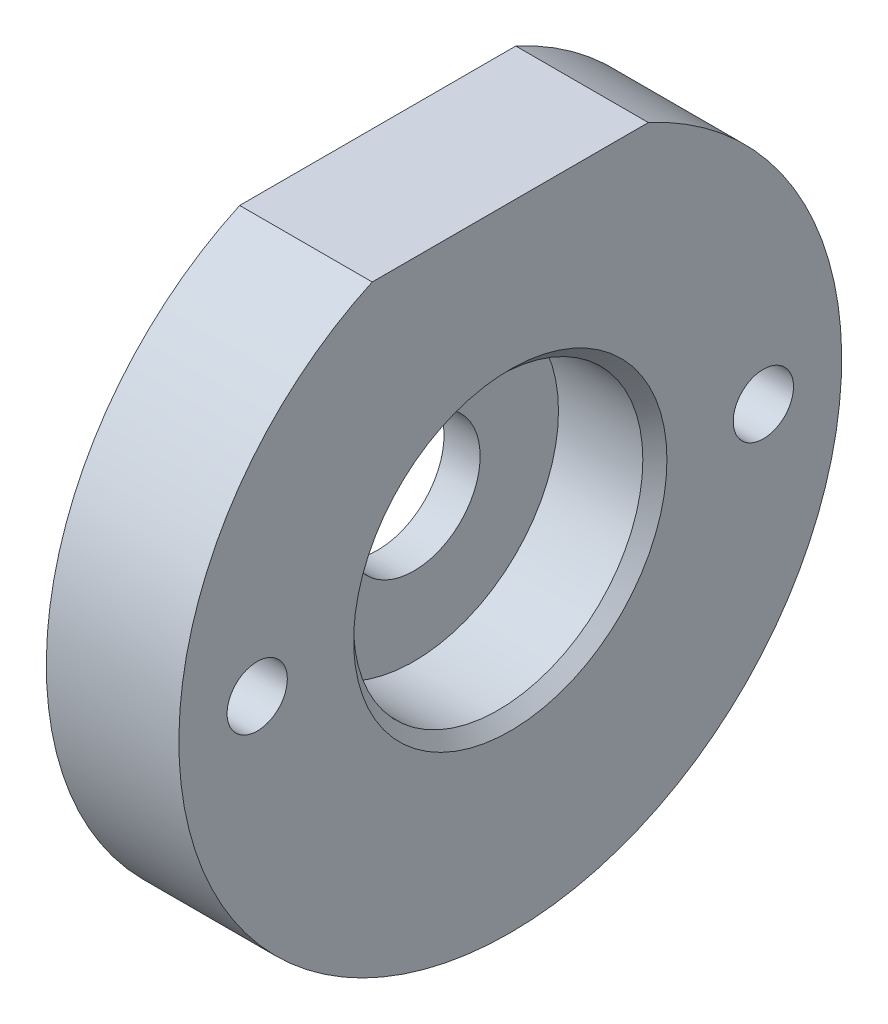
ISO-10303-21;
HEADER;
FILE_DESCRIPTION(('STEP AP214'),'2;1');
FILE_NAME('part.step','',(''),(''),'','','');
FILE_SCHEMA(('AUTOMOTIVE_DESIGN { 1 0 10303 214 1 1 1 1 }'));
ENDSEC;
DATA;
#1=APPLICATION_CONTEXT('core data for automotive mechanical design processes');
#2=APPLICATION_PROTOCOL_DEFINITION('international standard','automotive_design',2000,#1);
#3=PRODUCT_CONTEXT('',#1,'mechanical');
#4=PRODUCT('Part','Part','',(#3));
#5=PRODUCT_RELATED_PRODUCT_CATEGORY('part','',(#4));
#6=PRODUCT_DEFINITION_FORMATION('','',#4);
#7=PRODUCT_DEFINITION_CONTEXT('part definition',#1,'design');
#8=PRODUCT_DEFINITION('design','',#6,#7);
#9=PRODUCT_DEFINITION_SHAPE('','',#8);
#10=(LENGTH_UNIT() NAMED_UNIT(*) SI_UNIT(.MILLI.,.METRE.));
#11=(NAMED_UNIT(*) PLANE_ANGLE_UNIT() SI_UNIT($,.RADIAN.));
#12=(NAMED_UNIT(*) SI_UNIT($,.STERADIAN.) SOLID_ANGLE_UNIT());
#13=UNCERTAINTY_MEASURE_WITH_UNIT(LENGTH_MEASURE(1.E-05),#10,'distance_accuracy_value','');
#14=(GEOMETRIC_REPRESENTATION_CONTEXT(3) GLOBAL_UNCERTAINTY_ASSIGNED_CONTEXT((#13)) GLOBAL_UNIT_ASSIGNED_CONTEXT((#10,
#11,#12)) REPRESENTATION_CONTEXT('',''));
#15=CARTESIAN_POINT('',(0.,0.,0.));
#16=DIRECTION('',(0.,0.,1.));
#17=DIRECTION('',(1.,0.,0.));
#18=AXIS2_PLACEMENT_3D('',#15,#16,#17);
#19=CARTESIAN_POINT('',(11.,0.,0.));
#20=DIRECTION('',(1.,0.,0.));
#21=DIRECTION('',(0.,0.,-1.));
#22=AXIS2_PLACEMENT_3D('',#19,#20,#21);
#23=CONICAL_SURFACE('',#22,13.,0.785398163397455);
#24=CARTESIAN_POINT('',(9.99999999999999,0.,0.));
#25=DIRECTION('',(1.,0.,0.));
#26=DIRECTION('',(0.,0.,-1.));
#27=AXIS2_PLACEMENT_3D('',#24,#25,#26);
#28=CIRCLE('',#27,12.);
#29=CARTESIAN_POINT('',(9.99999999999999,0.,-12.));
#30=VERTEX_POINT('',#29);
#31=EDGE_CURVE('E67',#30,#30,#28,.F.);
#32=ORIENTED_EDGE('',*,*,#31,.T.);
#33=EDGE_LOOP('',(#32));
#34=FACE_BOUND('',#33,.T.);
#35=CARTESIAN_POINT('',(11.,0.,0.));
#36=DIRECTION('',(1.,0.,0.));
#37=DIRECTION('',(0.,0.,-1.));
#38=AXIS2_PLACEMENT_3D('',#35,#36,#37);
#39=CIRCLE('',#38,13.);
#40=CARTESIAN_POINT('',(11.,0.,-13.));
#41=VERTEX_POINT('',#40);
#42=EDGE_CURVE('E20',#41,#41,#39,.F.);
#43=ORIENTED_EDGE('',*,*,#42,.F.);
#44=EDGE_LOOP('',(#43));
#45=FACE_BOUND('',#44,.T.);
#46=ADVANCED_FACE('F17',(#34,#45),#23,.F.);
#47=CARTESIAN_POINT('',(3.,0.,0.));
#48=DIRECTION('',(1.,0.,0.));
#49=DIRECTION('',(0.,0.,-1.));
#50=AXIS2_PLACEMENT_3D('',#47,#48,#49);
#51=CYLINDRICAL_SURFACE('',#50,12.);
#52=ORIENTED_EDGE('',*,*,#31,.F.);
#53=EDGE_LOOP('',(#52));
#54=FACE_BOUND('',#53,.T.);
#55=CARTESIAN_POINT('',(3.,0.,0.));
#56=DIRECTION('',(1.,0.,0.));
#57=DIRECTION('',(0.,0.,-1.));
#58=AXIS2_PLACEMENT_3D('',#55,#56,#57);
#59=CIRCLE('',#58,12.);
#60=CARTESIAN_POINT('',(3.,0.,-12.));
#61=VERTEX_POINT('',#60);
#62=EDGE_CURVE('E81',#61,#61,#59,.T.);
#63=ORIENTED_EDGE('',*,*,#62,.F.);
#64=EDGE_LOOP('',(#63));
#65=FACE_BOUND('',#64,.T.);
#66=ADVANCED_FACE('F90',(#54,#65),#51,.F.);
#67=CARTESIAN_POINT('',(11.,0.,0.));
#68=DIRECTION('',(1.,0.,0.));
#69=DIRECTION('',(0.,0.,-1.));
#70=AXIS2_PLACEMENT_3D('',#67,#68,#69);
#71=PLANE('',#70);
#72=CARTESIAN_POINT('',(11.,0.,0.));
#73=DIRECTION('',(-1.,0.,0.));
#74=DIRECTION('',(0.,0.,1.));
#75=AXIS2_PLACEMENT_3D('',#72,#73,#74);
#76=CIRCLE('',#75,27.5);
#77=CARTESIAN_POINT('',(11.,25.,-11.4564392373896));
#78=VERTEX_POINT('',#77);
#79=CARTESIAN_POINT('',(11.,25.,11.4564392373896));
#80=VERTEX_POINT('',#79);
#81=EDGE_CURVE('E42',#78,#80,#76,.T.);
#82=ORIENTED_EDGE('',*,*,#81,.F.);
#83=DIRECTION('',(0.,0.,-1.));
#84=VECTOR('',#83,1.);
#85=CARTESIAN_POINT('',(11.,25.,11.4564392373896));
#86=LINE('',#85,#84);
#87=EDGE_CURVE('E48',#78,#80,#86,.F.);
#88=ORIENTED_EDGE('',*,*,#87,.T.);
#89=EDGE_LOOP('',(#82,#88));
#90=FACE_BOUND('',#89,.T.);
#91=ORIENTED_EDGE('',*,*,#42,.T.);
#92=EDGE_LOOP('',(#91));
#93=FACE_BOUND('',#92,.T.);
#94=CARTESIAN_POINT('',(11.,0.,-21.));
#95=DIRECTION('',(1.,0.,0.));
#96=DIRECTION('',(0.,0.,-1.));
#97=AXIS2_PLACEMENT_3D('',#94,#95,#96);
#98=CIRCLE('',#97,2.49999999999999);
#99=CARTESIAN_POINT('',(11.,0.,-23.5));
#100=VERTEX_POINT('',#99);
#101=EDGE_CURVE('E59',#100,#100,#98,.F.);
#102=ORIENTED_EDGE('',*,*,#101,.T.);
#103=EDGE_LOOP('',(#102));
#104=FACE_BOUND('',#103,.T.);
#105=CARTESIAN_POINT('',(11.,0.,21.));
#106=DIRECTION('',(1.,0.,0.));
#107=DIRECTION('',(0.,0.,-1.));
#108=AXIS2_PLACEMENT_3D('',#105,#106,#107);
#109=CIRCLE('',#108,2.49999999999999);
#110=CARTESIAN_POINT('',(11.,0.,18.5));
#111=VERTEX_POINT('',#110);
#112=EDGE_CURVE('E62',#111,#111,#109,.F.);
#113=ORIENTED_EDGE('',*,*,#112,.T.);
#114=EDGE_LOOP('',(#113));
#115=FACE_BOUND('',#114,.T.);
#116=ADVANCED_FACE('F46',(#90,#93,#104,#115),#71,.T.);
#117=CARTESIAN_POINT('',(3.,0.,0.));
#118=DIRECTION('',(1.,0.,0.));
#119=DIRECTION('',(0.,0.,-1.));
#120=AXIS2_PLACEMENT_3D('',#117,#118,#119);
#121=PLANE('',#120);
#122=ORIENTED_EDGE('',*,*,#62,.T.);
#123=EDGE_LOOP('',(#122));
#124=FACE_BOUND('',#123,.T.);
#125=CARTESIAN_POINT('',(3.,0.,0.));
#126=DIRECTION('',(-1.,0.,0.));
#127=DIRECTION('',(0.,0.,1.));
#128=AXIS2_PLACEMENT_3D('',#125,#126,#127);
#129=CIRCLE('',#128,5.5);
#130=CARTESIAN_POINT('',(3.,0.,5.5));
#131=VERTEX_POINT('',#130);
#132=EDGE_CURVE('E77',#131,#131,#129,.T.);
#133=ORIENTED_EDGE('',*,*,#132,.T.);
#134=EDGE_LOOP('',(#133));
#135=FACE_BOUND('',#134,.T.);
#136=ADVANCED_FACE('F120',(#124,#135),#121,.T.);
#137=CARTESIAN_POINT('',(11.,0.,21.));
#138=DIRECTION('',(1.,0.,0.));
#139=DIRECTION('',(0.,0.,-1.));
#140=AXIS2_PLACEMENT_3D('',#137,#138,#139);
#141=CYLINDRICAL_SURFACE('',#140,2.49999999999999);
#142=CARTESIAN_POINT('',(0.,0.,21.));
#143=DIRECTION('',(1.,0.,0.));
#144=DIRECTION('',(0.,0.,-1.));
#145=AXIS2_PLACEMENT_3D('',#142,#143,#144);
#146=CIRCLE('',#145,2.49999999999999);
#147=CARTESIAN_POINT('',(0.,0.,18.5));
#148=VERTEX_POINT('',#147);
#149=EDGE_CURVE('E74',#148,#148,#146,.F.);
#150=ORIENTED_EDGE('',*,*,#149,.T.);
#151=EDGE_LOOP('',(#150));
#152=FACE_BOUND('',#151,.T.);
#153=ORIENTED_EDGE('',*,*,#112,.F.);
#154=EDGE_LOOP('',(#153));
#155=FACE_BOUND('',#154,.T.);
#156=ADVANCED_FACE('F116',(#152,#155),#141,.F.);
#157=CARTESIAN_POINT('',(11.,0.,-21.));
#158=DIRECTION('',(1.,0.,0.));
#159=DIRECTION('',(0.,0.,-1.));
#160=AXIS2_PLACEMENT_3D('',#157,#158,#159);
#161=CYLINDRICAL_SURFACE('',#160,2.49999999999999);
#162=CARTESIAN_POINT('',(0.,0.,-21.));
#163=DIRECTION('',(1.,0.,0.));
#164=DIRECTION('',(0.,0.,-1.));
#165=AXIS2_PLACEMENT_3D('',#162,#163,#164);
#166=CIRCLE('',#165,2.49999999999999);
#167=CARTESIAN_POINT('',(0.,0.,-23.5));
#168=VERTEX_POINT('',#167);
#169=EDGE_CURVE('E71',#168,#168,#166,.F.);
#170=ORIENTED_EDGE('',*,*,#169,.T.);
#171=EDGE_LOOP('',(#170));
#172=FACE_BOUND('',#171,.T.);
#173=ORIENTED_EDGE('',*,*,#101,.F.);
#174=EDGE_LOOP('',(#173));
#175=FACE_BOUND('',#174,.T.);
#176=ADVANCED_FACE('F113',(#172,#175),#161,.F.);
#177=CARTESIAN_POINT('',(11.,25.,11.4564392373896));
#178=DIRECTION('',(0.,-1.,0.));
#179=DIRECTION('',(0.,0.,-1.));
#180=AXIS2_PLACEMENT_3D('',#177,#178,#179);
#181=PLANE('',#180);
#182=DIRECTION('',(-1.,0.,0.));
#183=VECTOR('',#182,1.);
#184=CARTESIAN_POINT('',(11.,25.,11.4564392373896));
#185=LINE('',#184,#183);
#186=CARTESIAN_POINT('',(0.,25.,11.4564392373896));
#187=VERTEX_POINT('',#186);
#188=EDGE_CURVE('E50',#80,#187,#185,.T.);
#189=ORIENTED_EDGE('',*,*,#188,.F.);
#190=ORIENTED_EDGE('',*,*,#87,.F.);
#191=DIRECTION('',(1.,0.,0.));
#192=VECTOR('',#191,1.);
#193=CARTESIAN_POINT('',(11.,25.,-11.4564392373896));
#194=LINE('',#193,#192);
#195=CARTESIAN_POINT('',(0.,25.,-11.4564392373896));
#196=VERTEX_POINT('',#195);
#197=EDGE_CURVE('E56',#196,#78,#194,.T.);
#198=ORIENTED_EDGE('',*,*,#197,.F.);
#199=DIRECTION('',(0.,0.,-1.));
#200=VECTOR('',#199,1.);
#201=CARTESIAN_POINT('',(0.,25.,0.));
#202=LINE('',#201,#200);
#203=EDGE_CURVE('E26',#196,#187,#202,.F.);
#204=ORIENTED_EDGE('',*,*,#203,.T.);
#205=EDGE_LOOP('',(#189,#190,#198,#204));
#206=FACE_BOUND('',#205,.T.);
#207=ADVANCED_FACE('F54',(#206),#181,.F.);
#208=CARTESIAN_POINT('',(11.,0.,0.));
#209=DIRECTION('',(-1.,0.,0.));
#210=DIRECTION('',(0.,0.,1.));
#211=AXIS2_PLACEMENT_3D('',#208,#209,#210);
#212=CYLINDRICAL_SURFACE('',#211,27.5);
#213=ORIENTED_EDGE('',*,*,#188,.T.);
#214=CARTESIAN_POINT('',(0.,0.,0.));
#215=DIRECTION('',(-1.,0.,0.));
#216=DIRECTION('',(0.,0.,1.));
#217=AXIS2_PLACEMENT_3D('',#214,#215,#216);
#218=CIRCLE('',#217,27.5);
#219=EDGE_CURVE('E34',#187,#196,#218,.F.);
#220=ORIENTED_EDGE('',*,*,#219,.T.);
#221=ORIENTED_EDGE('',*,*,#197,.T.);
#222=ORIENTED_EDGE('',*,*,#81,.T.);
#223=EDGE_LOOP('',(#213,#220,#221,#222));
#224=FACE_BOUND('',#223,.T.);
#225=ADVANCED_FACE('F58',(#224),#212,.T.);
#226=CARTESIAN_POINT('',(11.,0.,0.));
#227=DIRECTION('',(-1.,0.,0.));
#228=DIRECTION('',(0.,0.,1.));
#229=AXIS2_PLACEMENT_3D('',#226,#227,#228);
#230=CYLINDRICAL_SURFACE('',#229,5.5);
#231=CARTESIAN_POINT('',(0.,0.,0.));
#232=DIRECTION('',(-1.,0.,0.));
#233=DIRECTION('',(0.,0.,1.));
#234=AXIS2_PLACEMENT_3D('',#231,#232,#233);
#235=CIRCLE('',#234,5.5);
#236=CARTESIAN_POINT('',(0.,0.,5.5));
#237=VERTEX_POINT('',#236);
#238=EDGE_CURVE('E11',#237,#237,#235,.T.);
#239=ORIENTED_EDGE('',*,*,#238,.T.);
#240=EDGE_LOOP('',(#239));
#241=FACE_BOUND('',#240,.T.);
#242=ORIENTED_EDGE('',*,*,#132,.F.);
#243=EDGE_LOOP('',(#242));
#244=FACE_BOUND('',#243,.T.);
#245=ADVANCED_FACE('F99',(#241,#244),#230,.F.);
#246=CARTESIAN_POINT('',(0.,0.,0.));
#247=DIRECTION('',(1.,0.,0.));
#248=DIRECTION('',(0.,0.,-1.));
#249=AXIS2_PLACEMENT_3D('',#246,#247,#248);
#250=PLANE('',#249);
#251=ORIENTED_EDGE('',*,*,#238,.F.);
#252=EDGE_LOOP('',(#251));
#253=FACE_BOUND('',#252,.T.);
#254=ORIENTED_EDGE('',*,*,#203,.F.);
#255=ORIENTED_EDGE('',*,*,#219,.F.);
#256=EDGE_LOOP('',(#254,#255));
#257=FACE_BOUND('',#256,.T.);
#258=ORIENTED_EDGE('',*,*,#169,.F.);
#259=EDGE_LOOP('',(#258));
#260=FACE_BOUND('',#259,.T.);
#261=ORIENTED_EDGE('',*,*,#149,.F.);
#262=EDGE_LOOP('',(#261));
#263=FACE_BOUND('',#262,.T.);
#264=ADVANCED_FACE('F97',(#253,#257,#260,#263),#250,.F.);
#265=CLOSED_SHELL('',(#46,#66,#116,#136,#156,#176,#207,#225,#245,#264));
#266=MANIFOLD_SOLID_BREP('B1',#265);
#267=ADVANCED_BREP_SHAPE_REPRESENTATION('',(#18,#266),#14);
#268=SHAPE_DEFINITION_REPRESENTATION(#9,#267);
ENDSEC;
END-ISO-10303-21;
